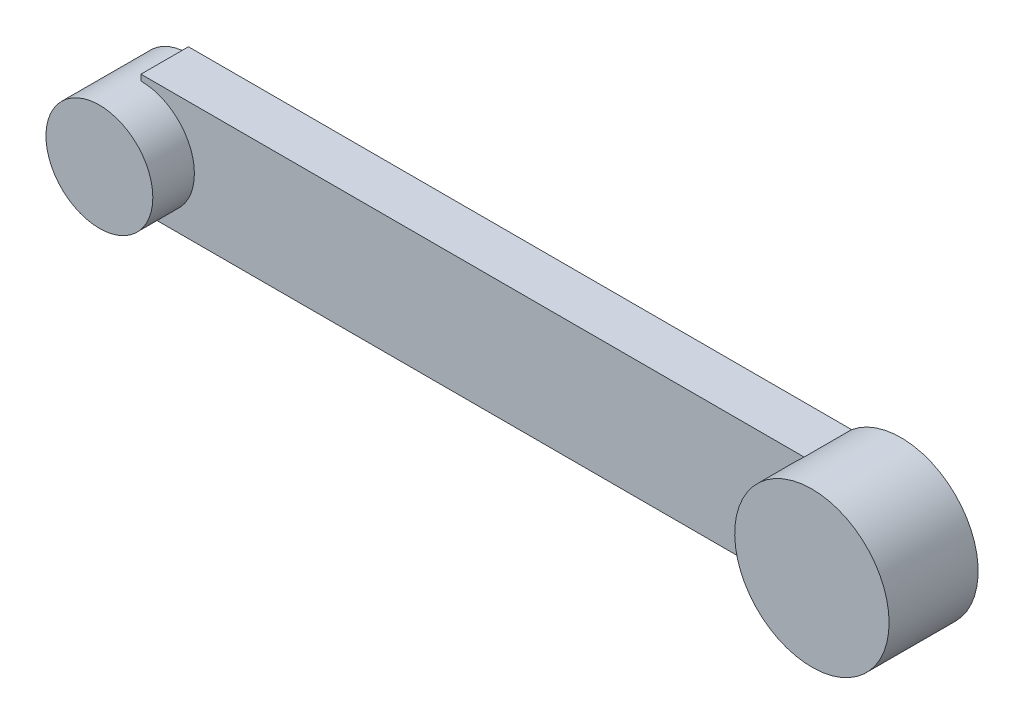
ISO-10303-21;
HEADER;
FILE_DESCRIPTION(('STEP AP214'),'2;1');
FILE_NAME('part.step','',(''),(''),'','','');
FILE_SCHEMA(('AUTOMOTIVE_DESIGN { 1 0 10303 214 1 1 1 1 }'));
ENDSEC;
DATA;
#1=APPLICATION_CONTEXT('core data for automotive mechanical design processes');
#2=APPLICATION_PROTOCOL_DEFINITION('international standard','automotive_design',2000,#1);
#3=PRODUCT_CONTEXT('',#1,'mechanical');
#4=PRODUCT('Part','Part','',(#3));
#5=PRODUCT_RELATED_PRODUCT_CATEGORY('part','',(#4));
#6=PRODUCT_DEFINITION_FORMATION('','',#4);
#7=PRODUCT_DEFINITION_CONTEXT('part definition',#1,'design');
#8=PRODUCT_DEFINITION('design','',#6,#7);
#9=PRODUCT_DEFINITION_SHAPE('','',#8);
#10=(LENGTH_UNIT() NAMED_UNIT(*) SI_UNIT(.MILLI.,.METRE.));
#11=(NAMED_UNIT(*) PLANE_ANGLE_UNIT() SI_UNIT($,.RADIAN.));
#12=(NAMED_UNIT(*) SI_UNIT($,.STERADIAN.) SOLID_ANGLE_UNIT());
#13=UNCERTAINTY_MEASURE_WITH_UNIT(LENGTH_MEASURE(1.E-05),#10,'distance_accuracy_value','');
#14=(GEOMETRIC_REPRESENTATION_CONTEXT(3) GLOBAL_UNCERTAINTY_ASSIGNED_CONTEXT((#13)) GLOBAL_UNIT_ASSIGNED_CONTEXT((#10,
#11,#12)) REPRESENTATION_CONTEXT('',''));
#15=CARTESIAN_POINT('',(0.,0.,0.));
#16=DIRECTION('',(0.,0.,1.));
#17=DIRECTION('',(1.,0.,0.));
#18=AXIS2_PLACEMENT_3D('',#15,#16,#17);
#19=CARTESIAN_POINT('',(110000.,105000.,8000.));
#20=DIRECTION('',(0.,1.,0.));
#21=DIRECTION('',(0.,0.,1.));
#22=AXIS2_PLACEMENT_3D('',#19,#20,#21);
#23=PLANE('',#22);
#24=DIRECTION('',(0.,0.,-1.));
#25=VECTOR('',#24,1.);
#26=CARTESIAN_POINT('',(221693.376137082,105000.,15000.));
#27=LINE('',#26,#25);
#28=CARTESIAN_POINT('',(221693.376137082,105000.,8000.));
#29=VERTEX_POINT('',#28);
#30=CARTESIAN_POINT('',(221693.376137082,105000.,0.));
#31=VERTEX_POINT('',#30);
#32=EDGE_CURVE('E110',#29,#31,#27,.T.);
#33=ORIENTED_EDGE('',*,*,#32,.F.);
#34=DIRECTION('',(1.,0.,0.));
#35=VECTOR('',#34,1.);
#36=CARTESIAN_POINT('',(110000.,105000.,8000.));
#37=LINE('',#36,#35);
#38=CARTESIAN_POINT('',(110000.,105000.,8000.));
#39=VERTEX_POINT('',#38);
#40=EDGE_CURVE('E98',#39,#29,#37,.T.);
#41=ORIENTED_EDGE('',*,*,#40,.F.);
#42=DIRECTION('',(0.,0.,-1.));
#43=VECTOR('',#42,1.);
#44=CARTESIAN_POINT('',(110000.,105000.,8000.));
#45=LINE('',#44,#43);
#46=CARTESIAN_POINT('',(110000.,105000.,0.));
#47=VERTEX_POINT('',#46);
#48=EDGE_CURVE('E11',#39,#47,#45,.T.);
#49=ORIENTED_EDGE('',*,*,#48,.T.);
#50=DIRECTION('',(1.,0.,0.));
#51=VECTOR('',#50,1.);
#52=CARTESIAN_POINT('',(110000.,105000.,0.));
#53=LINE('',#52,#51);
#54=EDGE_CURVE('E67',#47,#31,#53,.T.);
#55=ORIENTED_EDGE('',*,*,#54,.T.);
#56=EDGE_LOOP('',(#33,#41,#49,#55));
#57=FACE_BOUND('',#56,.T.);
#58=ADVANCED_FACE('F44',(#57),#23,.F.);
#59=CARTESIAN_POINT('',(110000.,125000.,8000.));
#60=DIRECTION('',(0.,-1.,0.));
#61=DIRECTION('',(0.,0.,-1.));
#62=AXIS2_PLACEMENT_3D('',#59,#60,#61);
#63=PLANE('',#62);
#64=DIRECTION('',(0.,0.,-1.));
#65=VECTOR('',#64,1.);
#66=CARTESIAN_POINT('',(221693.376137082,125000.,15000.));
#67=LINE('',#66,#65);
#68=CARTESIAN_POINT('',(221693.376137082,125000.,0.));
#69=VERTEX_POINT('',#68);
#70=CARTESIAN_POINT('',(221693.376137082,125000.,8000.));
#71=VERTEX_POINT('',#70);
#72=EDGE_CURVE('E114',#69,#71,#67,.F.);
#73=ORIENTED_EDGE('',*,*,#72,.F.);
#74=DIRECTION('',(-1.,0.,0.));
#75=VECTOR('',#74,1.);
#76=CARTESIAN_POINT('',(110000.,125000.,0.));
#77=LINE('',#76,#75);
#78=CARTESIAN_POINT('',(110000.,125000.,0.));
#79=VERTEX_POINT('',#78);
#80=EDGE_CURVE('E160',#69,#79,#77,.T.);
#81=ORIENTED_EDGE('',*,*,#80,.T.);
#82=DIRECTION('',(0.,0.,-1.));
#83=VECTOR('',#82,1.);
#84=CARTESIAN_POINT('',(110000.,125000.,8000.));
#85=LINE('',#84,#83);
#86=CARTESIAN_POINT('',(110000.,125000.,8000.));
#87=VERTEX_POINT('',#86);
#88=EDGE_CURVE('E53',#87,#79,#85,.T.);
#89=ORIENTED_EDGE('',*,*,#88,.F.);
#90=DIRECTION('',(-1.,0.,0.));
#91=VECTOR('',#90,1.);
#92=CARTESIAN_POINT('',(110000.,125000.,8000.));
#93=LINE('',#92,#91);
#94=EDGE_CURVE('E102',#71,#87,#93,.T.);
#95=ORIENTED_EDGE('',*,*,#94,.F.);
#96=EDGE_LOOP('',(#73,#81,#89,#95));
#97=FACE_BOUND('',#96,.T.);
#98=ADVANCED_FACE('F179',(#97),#63,.F.);
#99=CARTESIAN_POINT('',(110000.,105000.,8000.));
#100=DIRECTION('',(1.,0.,0.));
#101=DIRECTION('',(0.,0.,-1.));
#102=AXIS2_PLACEMENT_3D('',#99,#100,#101);
#103=PLANE('',#102);
#104=DIRECTION('',(0.,0.,-1.));
#105=VECTOR('',#104,1.);
#106=CARTESIAN_POINT('',(110000.,106000.,15000.));
#107=LINE('',#106,#105);
#108=CARTESIAN_POINT('',(110000.,106000.,0.));
#109=VERTEX_POINT('',#108);
#110=CARTESIAN_POINT('',(110000.,106000.,8000.));
#111=VERTEX_POINT('',#110);
#112=EDGE_CURVE('E141',#109,#111,#107,.F.);
#113=ORIENTED_EDGE('',*,*,#112,.F.);
#114=DIRECTION('',(0.,-1.,0.));
#115=VECTOR('',#114,1.);
#116=CARTESIAN_POINT('',(110000.,105000.,0.));
#117=LINE('',#116,#115);
#118=EDGE_CURVE('E150',#109,#47,#117,.T.);
#119=ORIENTED_EDGE('',*,*,#118,.T.);
#120=ORIENTED_EDGE('',*,*,#48,.F.);
#121=DIRECTION('',(0.,-1.,0.));
#122=VECTOR('',#121,1.);
#123=CARTESIAN_POINT('',(110000.,105000.,8000.));
#124=LINE('',#123,#122);
#125=EDGE_CURVE('E101',#111,#39,#124,.T.);
#126=ORIENTED_EDGE('',*,*,#125,.F.);
#127=EDGE_LOOP('',(#113,#119,#120,#126));
#128=FACE_BOUND('',#127,.T.);
#129=ADVANCED_FACE('F50',(#128),#103,.F.);
#130=DIRECTION('',(0.,0.,-1.));
#131=VECTOR('',#130,1.);
#132=CARTESIAN_POINT('',(110000.,124000.,15000.));
#133=LINE('',#132,#131);
#134=CARTESIAN_POINT('',(110000.,124000.,8000.));
#135=VERTEX_POINT('',#134);
#136=CARTESIAN_POINT('',(110000.,124000.,0.));
#137=VERTEX_POINT('',#136);
#138=EDGE_CURVE('E138',#135,#137,#133,.T.);
#139=ORIENTED_EDGE('',*,*,#138,.F.);
#140=EDGE_CURVE('E104',#87,#135,#124,.T.);
#141=ORIENTED_EDGE('',*,*,#140,.F.);
#142=ORIENTED_EDGE('',*,*,#88,.T.);
#143=EDGE_CURVE('E155',#79,#137,#117,.T.);
#144=ORIENTED_EDGE('',*,*,#143,.T.);
#145=EDGE_LOOP('',(#139,#141,#142,#144));
#146=FACE_BOUND('',#145,.T.);
#147=ADVANCED_FACE('F167',(#146),#103,.F.);
#148=CARTESIAN_POINT('',(0.,0.,8000.));
#149=DIRECTION('',(0.,0.,-1.));
#150=DIRECTION('',(-1.,0.,0.));
#151=AXIS2_PLACEMENT_3D('',#148,#149,#150);
#152=PLANE('',#151);
#153=CARTESIAN_POINT('',(230000.,115000.,8000.));
#154=DIRECTION('',(0.,0.,-1.));
#155=DIRECTION('',(-1.,0.,0.));
#156=AXIS2_PLACEMENT_3D('',#153,#154,#155);
#157=CIRCLE('',#156,13000.);
#158=EDGE_CURVE('E63',#71,#29,#157,.F.);
#159=ORIENTED_EDGE('',*,*,#158,.F.);
#160=ORIENTED_EDGE('',*,*,#94,.T.);
#161=ORIENTED_EDGE('',*,*,#140,.T.);
#162=CARTESIAN_POINT('',(110000.,115000.,8000.));
#163=DIRECTION('',(0.,0.,-1.));
#164=DIRECTION('',(-1.,0.,0.));
#165=AXIS2_PLACEMENT_3D('',#162,#163,#164);
#166=CIRCLE('',#165,9000.);
#167=EDGE_CURVE('E134',#111,#135,#166,.F.);
#168=ORIENTED_EDGE('',*,*,#167,.F.);
#169=ORIENTED_EDGE('',*,*,#125,.T.);
#170=ORIENTED_EDGE('',*,*,#40,.T.);
#171=EDGE_LOOP('',(#159,#160,#161,#168,#169,#170));
#172=FACE_BOUND('',#171,.T.);
#173=ADVANCED_FACE('F97',(#172),#152,.F.);
#174=CARTESIAN_POINT('',(0.,0.,0.));
#175=DIRECTION('',(0.,0.,-1.));
#176=DIRECTION('',(-1.,0.,0.));
#177=AXIS2_PLACEMENT_3D('',#174,#175,#176);
#178=PLANE('',#177);
#179=ORIENTED_EDGE('',*,*,#80,.F.);
#180=CARTESIAN_POINT('',(230000.,115000.,0.));
#181=DIRECTION('',(0.,0.,1.));
#182=DIRECTION('',(1.,0.,0.));
#183=AXIS2_PLACEMENT_3D('',#180,#181,#182);
#184=CIRCLE('',#183,13000.);
#185=EDGE_CURVE('E123',#31,#69,#184,.T.);
#186=ORIENTED_EDGE('',*,*,#185,.F.);
#187=ORIENTED_EDGE('',*,*,#54,.F.);
#188=ORIENTED_EDGE('',*,*,#118,.F.);
#189=CARTESIAN_POINT('',(110000.,115000.,0.));
#190=DIRECTION('',(0.,0.,1.));
#191=DIRECTION('',(1.,0.,0.));
#192=AXIS2_PLACEMENT_3D('',#189,#190,#191);
#193=CIRCLE('',#192,9000.);
#194=EDGE_CURVE('E115',#137,#109,#193,.T.);
#195=ORIENTED_EDGE('',*,*,#194,.F.);
#196=ORIENTED_EDGE('',*,*,#143,.F.);
#197=EDGE_LOOP('',(#179,#186,#187,#188,#195,#196));
#198=FACE_BOUND('',#197,.T.);
#199=ADVANCED_FACE('F173',(#198),#178,.T.);
#200=CARTESIAN_POINT('',(110000.,115000.,15000.));
#201=DIRECTION('',(0.,0.,-1.));
#202=DIRECTION('',(-1.,0.,0.));
#203=AXIS2_PLACEMENT_3D('',#200,#201,#202);
#204=CYLINDRICAL_SURFACE('',#203,9000.);
#205=CARTESIAN_POINT('',(110000.,115000.,15000.));
#206=DIRECTION('',(0.,0.,1.));
#207=DIRECTION('',(1.,0.,0.));
#208=AXIS2_PLACEMENT_3D('',#205,#206,#207);
#209=CIRCLE('',#208,9000.);
#210=CARTESIAN_POINT('',(119000.,115000.,15000.));
#211=VERTEX_POINT('',#210);
#212=EDGE_CURVE('E126',#211,#211,#209,.T.);
#213=ORIENTED_EDGE('',*,*,#212,.F.);
#214=EDGE_LOOP('',(#213));
#215=FACE_BOUND('',#214,.T.);
#216=ORIENTED_EDGE('',*,*,#194,.T.);
#217=ORIENTED_EDGE('',*,*,#112,.T.);
#218=ORIENTED_EDGE('',*,*,#167,.T.);
#219=ORIENTED_EDGE('',*,*,#138,.T.);
#220=EDGE_LOOP('',(#216,#217,#218,#219));
#221=FACE_BOUND('',#220,.T.);
#222=ADVANCED_FACE('F175',(#215,#221),#204,.T.);
#223=CARTESIAN_POINT('',(110000.,115000.,15000.));
#224=DIRECTION('',(0.,0.,1.));
#225=DIRECTION('',(1.,0.,0.));
#226=AXIS2_PLACEMENT_3D('',#223,#224,#225);
#227=PLANE('',#226);
#228=ORIENTED_EDGE('',*,*,#212,.T.);
#229=EDGE_LOOP('',(#228));
#230=FACE_BOUND('',#229,.T.);
#231=ADVANCED_FACE('F197',(#230),#227,.T.);
#232=CARTESIAN_POINT('',(230000.,115000.,15000.));
#233=DIRECTION('',(0.,0.,-1.));
#234=DIRECTION('',(-1.,0.,0.));
#235=AXIS2_PLACEMENT_3D('',#232,#233,#234);
#236=CYLINDRICAL_SURFACE('',#235,13000.);
#237=CARTESIAN_POINT('',(230000.,115000.,15000.));
#238=DIRECTION('',(0.,0.,1.));
#239=DIRECTION('',(1.,0.,0.));
#240=AXIS2_PLACEMENT_3D('',#237,#238,#239);
#241=CIRCLE('',#240,13000.);
#242=CARTESIAN_POINT('',(243000.,115000.,15000.));
#243=VERTEX_POINT('',#242);
#244=EDGE_CURVE('E117',#243,#243,#241,.T.);
#245=ORIENTED_EDGE('',*,*,#244,.F.);
#246=EDGE_LOOP('',(#245));
#247=FACE_BOUND('',#246,.T.);
#248=ORIENTED_EDGE('',*,*,#158,.T.);
#249=ORIENTED_EDGE('',*,*,#32,.T.);
#250=ORIENTED_EDGE('',*,*,#185,.T.);
#251=ORIENTED_EDGE('',*,*,#72,.T.);
#252=EDGE_LOOP('',(#248,#249,#250,#251));
#253=FACE_BOUND('',#252,.T.);
#254=ADVANCED_FACE('F118',(#247,#253),#236,.T.);
#255=CARTESIAN_POINT('',(230000.,115000.,15000.));
#256=DIRECTION('',(0.,0.,1.));
#257=DIRECTION('',(1.,0.,0.));
#258=AXIS2_PLACEMENT_3D('',#255,#256,#257);
#259=PLANE('',#258);
#260=ORIENTED_EDGE('',*,*,#244,.T.);
#261=EDGE_LOOP('',(#260));
#262=FACE_BOUND('',#261,.T.);
#263=ADVANCED_FACE('F201',(#262),#259,.T.);
#264=CLOSED_SHELL('',(#58,#98,#129,#147,#173,#199,#222,#231,#254,#263));
#265=MANIFOLD_SOLID_BREP('B2',#264);
#266=ADVANCED_BREP_SHAPE_REPRESENTATION('',(#18,#265),#14);
#267=SHAPE_DEFINITION_REPRESENTATION(#9,#266);
ENDSEC;
END-ISO-10303-21;
